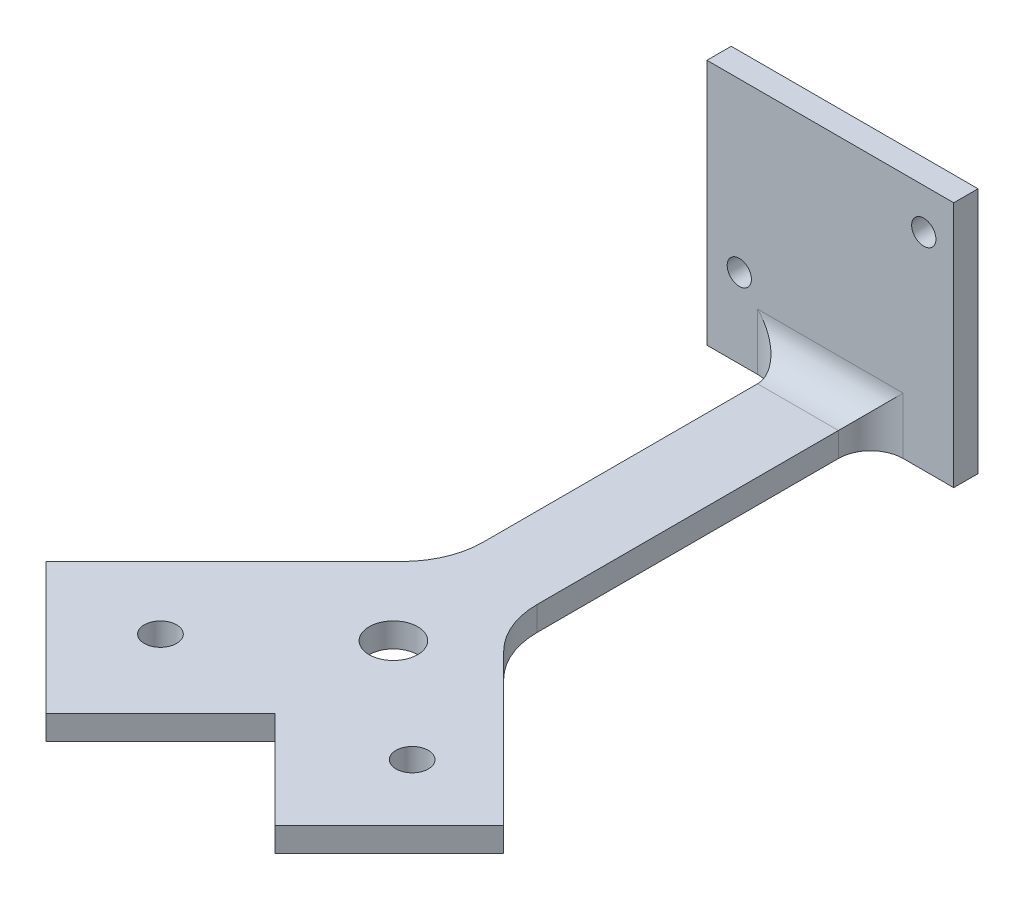
ISO-10303-21;
HEADER;
FILE_DESCRIPTION(('STEP AP214'),'2;1');
FILE_NAME('part.step','',(''),(''),'','','');
FILE_SCHEMA(('AUTOMOTIVE_DESIGN { 1 0 10303 214 1 1 1 1 }'));
ENDSEC;
DATA;
#1=APPLICATION_CONTEXT('core data for automotive mechanical design processes');
#2=APPLICATION_PROTOCOL_DEFINITION('international standard','automotive_design',2000,#1);
#3=PRODUCT_CONTEXT('',#1,'mechanical');
#4=PRODUCT('Part','Part','',(#3));
#5=PRODUCT_RELATED_PRODUCT_CATEGORY('part','',(#4));
#6=PRODUCT_DEFINITION_FORMATION('','',#4);
#7=PRODUCT_DEFINITION_CONTEXT('part definition',#1,'design');
#8=PRODUCT_DEFINITION('design','',#6,#7);
#9=PRODUCT_DEFINITION_SHAPE('','',#8);
#10=(LENGTH_UNIT() NAMED_UNIT(*) SI_UNIT(.MILLI.,.METRE.));
#11=(NAMED_UNIT(*) PLANE_ANGLE_UNIT() SI_UNIT($,.RADIAN.));
#12=(NAMED_UNIT(*) SI_UNIT($,.STERADIAN.) SOLID_ANGLE_UNIT());
#13=UNCERTAINTY_MEASURE_WITH_UNIT(LENGTH_MEASURE(1.E-05),#10,'distance_accuracy_value','');
#14=(GEOMETRIC_REPRESENTATION_CONTEXT(3) GLOBAL_UNCERTAINTY_ASSIGNED_CONTEXT((#13)) GLOBAL_UNIT_ASSIGNED_CONTEXT((#10,
#11,#12)) REPRESENTATION_CONTEXT('',''));
#15=CARTESIAN_POINT('',(0.,0.,0.));
#16=DIRECTION('',(0.,0.,1.));
#17=DIRECTION('',(1.,0.,0.));
#18=AXIS2_PLACEMENT_3D('',#15,#16,#17);
#19=CARTESIAN_POINT('',(0.,0.,3.));
#20=DIRECTION('',(0.,0.,-1.));
#21=DIRECTION('',(-1.,0.,0.));
#22=AXIS2_PLACEMENT_3D('',#19,#20,#21);
#23=PLANE('',#22);
#24=CARTESIAN_POINT('',(26.8,25.5,3.));
#25=DIRECTION('',(0.,0.,1.));
#26=DIRECTION('',(1.,0.,0.));
#27=AXIS2_PLACEMENT_3D('',#24,#25,#26);
#28=CIRCLE('',#27,1.49999999999999);
#29=CARTESIAN_POINT('',(28.3,25.5,3.));
#30=VERTEX_POINT('',#29);
#31=EDGE_CURVE('E562',#30,#30,#28,.T.);
#32=ORIENTED_EDGE('',*,*,#31,.F.);
#33=EDGE_LOOP('',(#32));
#34=FACE_BOUND('',#33,.T.);
#35=DIRECTION('',(1.,0.,0.));
#36=VECTOR('',#35,1.);
#37=CARTESIAN_POINT('',(0.,7.,3.));
#38=LINE('',#37,#36);
#39=CARTESIAN_POINT('',(6.25,7.,3.));
#40=VERTEX_POINT('',#39);
#41=CARTESIAN_POINT('',(24.25,7.,3.));
#42=VERTEX_POINT('',#41);
#43=EDGE_CURVE('E253',#40,#42,#38,.T.);
#44=ORIENTED_EDGE('',*,*,#43,.T.);
#45=DIRECTION('',(0.,-1.,0.));
#46=VECTOR('',#45,1.);
#47=CARTESIAN_POINT('',(24.25,0.,3.));
#48=LINE('',#47,#46);
#49=CARTESIAN_POINT('',(24.25,0.,3.));
#50=VERTEX_POINT('',#49);
#51=EDGE_CURVE('E257',#42,#50,#48,.T.);
#52=ORIENTED_EDGE('',*,*,#51,.T.);
#53=DIRECTION('',(1.,0.,0.));
#54=VECTOR('',#53,1.);
#55=CARTESIAN_POINT('',(0.,0.,3.));
#56=LINE('',#55,#54);
#57=CARTESIAN_POINT('',(30.5,0.,3.));
#58=VERTEX_POINT('',#57);
#59=EDGE_CURVE('E225',#50,#58,#56,.T.);
#60=ORIENTED_EDGE('',*,*,#59,.T.);
#61=DIRECTION('',(0.,1.,0.));
#62=VECTOR('',#61,1.);
#63=CARTESIAN_POINT('',(30.5,0.,3.));
#64=LINE('',#63,#62);
#65=CARTESIAN_POINT('',(30.5,30.5,3.));
#66=VERTEX_POINT('',#65);
#67=EDGE_CURVE('E230',#58,#66,#64,.T.);
#68=ORIENTED_EDGE('',*,*,#67,.T.);
#69=DIRECTION('',(-1.,0.,0.));
#70=VECTOR('',#69,1.);
#71=CARTESIAN_POINT('',(0.,30.5,3.));
#72=LINE('',#71,#70);
#73=CARTESIAN_POINT('',(0.,30.5,3.));
#74=VERTEX_POINT('',#73);
#75=EDGE_CURVE('E232',#66,#74,#72,.T.);
#76=ORIENTED_EDGE('',*,*,#75,.T.);
#77=DIRECTION('',(0.,-1.,0.));
#78=VECTOR('',#77,1.);
#79=CARTESIAN_POINT('',(0.,0.,3.));
#80=LINE('',#79,#78);
#81=CARTESIAN_POINT('',(0.,0.,3.));
#82=VERTEX_POINT('',#81);
#83=EDGE_CURVE('E222',#74,#82,#80,.T.);
#84=ORIENTED_EDGE('',*,*,#83,.T.);
#85=CARTESIAN_POINT('',(6.25,0.,3.));
#86=VERTEX_POINT('',#85);
#87=EDGE_CURVE('E227',#82,#86,#56,.T.);
#88=ORIENTED_EDGE('',*,*,#87,.T.);
#89=DIRECTION('',(0.,-1.,0.));
#90=VECTOR('',#89,1.);
#91=CARTESIAN_POINT('',(6.25,0.,3.));
#92=LINE('',#91,#90);
#93=EDGE_CURVE('E255',#86,#40,#92,.F.);
#94=ORIENTED_EDGE('',*,*,#93,.T.);
#95=EDGE_LOOP('',(#44,#52,#60,#68,#76,#84,#88,#94));
#96=FACE_BOUND('',#95,.T.);
#97=CARTESIAN_POINT('',(4.,9.80000000000002,3.));
#98=DIRECTION('',(0.,0.,1.));
#99=DIRECTION('',(1.,0.,0.));
#100=AXIS2_PLACEMENT_3D('',#97,#98,#99);
#101=CIRCLE('',#100,1.49999999999999);
#102=CARTESIAN_POINT('',(5.49999999999999,9.80000000000002,3.));
#103=VERTEX_POINT('',#102);
#104=EDGE_CURVE('E279',#103,#103,#101,.T.);
#105=ORIENTED_EDGE('',*,*,#104,.F.);
#106=EDGE_LOOP('',(#105));
#107=FACE_BOUND('',#106,.T.);
#108=ADVANCED_FACE('F33',(#34,#96,#107),#23,.F.);
#109=CARTESIAN_POINT('',(0.,0.,3.));
#110=DIRECTION('',(1.,0.,0.));
#111=DIRECTION('',(0.,0.,-1.));
#112=AXIS2_PLACEMENT_3D('',#109,#110,#111);
#113=PLANE('',#112);
#114=DIRECTION('',(0.,-1.,0.));
#115=VECTOR('',#114,1.);
#116=CARTESIAN_POINT('',(0.,0.,0.));
#117=LINE('',#116,#115);
#118=CARTESIAN_POINT('',(0.,30.5,0.));
#119=VERTEX_POINT('',#118);
#120=CARTESIAN_POINT('',(0.,0.,0.));
#121=VERTEX_POINT('',#120);
#122=EDGE_CURVE('E218',#119,#121,#117,.T.);
#123=ORIENTED_EDGE('',*,*,#122,.T.);
#124=DIRECTION('',(0.,0.,-1.));
#125=VECTOR('',#124,1.);
#126=CARTESIAN_POINT('',(0.,0.,3.));
#127=LINE('',#126,#125);
#128=EDGE_CURVE('E250',#82,#121,#127,.T.);
#129=ORIENTED_EDGE('',*,*,#128,.F.);
#130=ORIENTED_EDGE('',*,*,#83,.F.);
#131=DIRECTION('',(0.,0.,-1.));
#132=VECTOR('',#131,1.);
#133=CARTESIAN_POINT('',(0.,30.5,3.));
#134=LINE('',#133,#132);
#135=EDGE_CURVE('E234',#74,#119,#134,.T.);
#136=ORIENTED_EDGE('',*,*,#135,.T.);
#137=EDGE_LOOP('',(#123,#129,#130,#136));
#138=FACE_BOUND('',#137,.T.);
#139=ADVANCED_FACE('F342',(#138),#113,.F.);
#140=CARTESIAN_POINT('',(0.,0.,3.));
#141=DIRECTION('',(0.,1.,0.));
#142=DIRECTION('',(0.,0.,1.));
#143=AXIS2_PLACEMENT_3D('',#140,#141,#142);
#144=PLANE('',#143);
#145=CARTESIAN_POINT('',(29.1407993885725,0.,68.5740221249233));
#146=DIRECTION('',(0.,1.,0.));
#147=DIRECTION('',(0.,0.,1.));
#148=AXIS2_PLACEMENT_3D('',#145,#146,#147);
#149=CIRCLE('',#148,1.99999999999999);
#150=CARTESIAN_POINT('',(29.1407993885725,0.,70.5740221249233));
#151=VERTEX_POINT('',#150);
#152=EDGE_CURVE('E539',#151,#151,#149,.T.);
#153=ORIENTED_EDGE('',*,*,#152,.T.);
#154=EDGE_LOOP('',(#153));
#155=FACE_BOUND('',#154,.T.);
#156=CARTESIAN_POINT('',(0.149421359902709,0.,70.6953424684618));
#157=DIRECTION('',(0.,1.,0.));
#158=DIRECTION('',(0.,0.,1.));
#159=AXIS2_PLACEMENT_3D('',#156,#157,#158);
#160=CIRCLE('',#159,2.);
#161=CARTESIAN_POINT('',(0.149421359902709,0.,72.6953424684618));
#162=VERTEX_POINT('',#161);
#163=EDGE_CURVE('E549',#162,#162,#160,.T.);
#164=ORIENTED_EDGE('',*,*,#163,.T.);
#165=EDGE_LOOP('',(#164));
#166=FACE_BOUND('',#165,.T.);
#167=CARTESIAN_POINT('',(15.25,0.,57.));
#168=DIRECTION('',(0.,1.,0.));
#169=DIRECTION('',(0.,0.,1.));
#170=AXIS2_PLACEMENT_3D('',#167,#168,#169);
#171=CIRCLE('',#170,3.);
#172=CARTESIAN_POINT('',(15.25,0.,60.));
#173=VERTEX_POINT('',#172);
#174=EDGE_CURVE('E276',#173,#173,#171,.T.);
#175=ORIENTED_EDGE('',*,*,#174,.T.);
#176=EDGE_LOOP('',(#175));
#177=FACE_BOUND('',#176,.T.);
#178=ORIENTED_EDGE('',*,*,#59,.F.);
#179=CARTESIAN_POINT('',(24.25,0.,7.));
#180=DIRECTION('',(0.,1.,0.));
#181=DIRECTION('',(0.,0.,1.));
#182=AXIS2_PLACEMENT_3D('',#179,#180,#181);
#183=CIRCLE('',#182,4.);
#184=CARTESIAN_POINT('',(20.25,0.,7.));
#185=VERTEX_POINT('',#184);
#186=EDGE_CURVE('E268',#50,#185,#183,.T.);
#187=ORIENTED_EDGE('',*,*,#186,.T.);
#188=DIRECTION('',(0.,0.,1.));
#189=VECTOR('',#188,1.);
#190=CARTESIAN_POINT('',(20.25,0.,3.));
#191=LINE('',#190,#189);
#192=CARTESIAN_POINT('',(20.25,0.,44.227378613635));
#193=VERTEX_POINT('',#192);
#194=EDGE_CURVE('E215',#185,#193,#191,.T.);
#195=ORIENTED_EDGE('',*,*,#194,.T.);
#196=CARTESIAN_POINT('',(30.25,0.,44.227378613635));
#197=DIRECTION('',(0.,1.,0.));
#198=DIRECTION('',(0.,0.,1.));
#199=AXIS2_PLACEMENT_3D('',#196,#197,#198);
#200=CIRCLE('',#199,10.);
#201=CARTESIAN_POINT('',(23.1789321881345,0.,51.2984464255005));
#202=VERTEX_POINT('',#201);
#203=EDGE_CURVE('E289',#193,#202,#200,.T.);
#204=ORIENTED_EDGE('',*,*,#203,.T.);
#205=DIRECTION('',(0.707106781186543,0.,0.707106781186552));
#206=VECTOR('',#205,1.);
#207=CARTESIAN_POINT('',(22.5652428813171,0.,50.6847571186831));
#208=LINE('',#207,#206);
#209=CARTESIAN_POINT('',(41.8687214499304,0.,69.9882356872966));
#210=VERTEX_POINT('',#209);
#211=EDGE_CURVE('E162',#202,#210,#208,.T.);
#212=ORIENTED_EDGE('',*,*,#211,.T.);
#213=DIRECTION('',(-0.707106781186551,0.,0.707106781186544));
#214=VECTOR('',#213,1.);
#215=CARTESIAN_POINT('',(27.7265858261993,0.,84.1303713110274));
#216=LINE('',#215,#214);
#217=CARTESIAN_POINT('',(27.7265858261993,0.,84.1303713110274));
#218=VERTEX_POINT('',#217);
#219=EDGE_CURVE('E168',#210,#218,#216,.T.);
#220=ORIENTED_EDGE('',*,*,#219,.T.);
#221=DIRECTION('',(-0.707106781186544,0.,-0.707106781186551));
#222=VECTOR('',#221,1.);
#223=CARTESIAN_POINT('',(15.7057705460281,0.,72.109556030856));
#224=LINE('',#223,#222);
#225=CARTESIAN_POINT('',(15.7057705460281,0.,72.109556030856));
#226=VERTEX_POINT('',#225);
#227=EDGE_CURVE('E191',#218,#226,#224,.T.);
#228=ORIENTED_EDGE('',*,*,#227,.T.);
#229=DIRECTION('',(-0.707106781186551,0.,0.707106781186544));
#230=VECTOR('',#229,1.);
#231=CARTESIAN_POINT('',(1.56363492229706,0.,86.2516916545869));
#232=LINE('',#231,#230);
#233=CARTESIAN_POINT('',(1.56363492229706,0.,86.2516916545869));
#234=VERTEX_POINT('',#233);
#235=EDGE_CURVE('E195',#226,#234,#232,.T.);
#236=ORIENTED_EDGE('',*,*,#235,.T.);
#237=DIRECTION('',(-0.707106781186544,0.,-0.707106781186552));
#238=VECTOR('',#237,1.);
#239=CARTESIAN_POINT('',(-14.6998210449934,0.,69.9882356872962));
#240=LINE('',#239,#238);
#241=CARTESIAN_POINT('',(-14.6998210449934,0.,69.9882356872962));
#242=VERTEX_POINT('',#241);
#243=EDGE_CURVE('E198',#234,#242,#240,.T.);
#244=ORIENTED_EDGE('',*,*,#243,.T.);
#245=DIRECTION('',(0.707106781186551,0.,-0.707106781186544));
#246=VECTOR('',#245,1.);
#247=CARTESIAN_POINT('',(13.5844502024686,0.,41.7039644398345));
#248=LINE('',#247,#246);
#249=CARTESIAN_POINT('',(7.32106781186544,0.,47.9673468304376));
#250=VERTEX_POINT('',#249);
#251=EDGE_CURVE('E201',#242,#250,#248,.T.);
#252=ORIENTED_EDGE('',*,*,#251,.T.);
#253=CARTESIAN_POINT('',(0.25,0.,40.8962790185721));
#254=DIRECTION('',(0.,1.,0.));
#255=DIRECTION('',(0.,0.,1.));
#256=AXIS2_PLACEMENT_3D('',#253,#254,#255);
#257=CIRCLE('',#256,10.);
#258=CARTESIAN_POINT('',(10.25,0.,40.8962790185721));
#259=VERTEX_POINT('',#258);
#260=EDGE_CURVE('E41',#250,#259,#257,.T.);
#261=ORIENTED_EDGE('',*,*,#260,.T.);
#262=DIRECTION('',(0.,0.,-1.));
#263=VECTOR('',#262,1.);
#264=CARTESIAN_POINT('',(10.25,0.,3.));
#265=LINE('',#264,#263);
#266=CARTESIAN_POINT('',(10.25,0.,7.));
#267=VERTEX_POINT('',#266);
#268=EDGE_CURVE('E206',#259,#267,#265,.T.);
#269=ORIENTED_EDGE('',*,*,#268,.T.);
#270=CARTESIAN_POINT('',(6.25,0.,7.));
#271=DIRECTION('',(0.,1.,0.));
#272=DIRECTION('',(0.,0.,1.));
#273=AXIS2_PLACEMENT_3D('',#270,#271,#272);
#274=CIRCLE('',#273,4.);
#275=EDGE_CURVE('E270',#267,#86,#274,.T.);
#276=ORIENTED_EDGE('',*,*,#275,.T.);
#277=ORIENTED_EDGE('',*,*,#87,.F.);
#278=ORIENTED_EDGE('',*,*,#128,.T.);
#279=DIRECTION('',(1.,0.,0.));
#280=VECTOR('',#279,1.);
#281=CARTESIAN_POINT('',(0.,0.,0.));
#282=LINE('',#281,#280);
#283=CARTESIAN_POINT('',(30.5,0.,0.));
#284=VERTEX_POINT('',#283);
#285=EDGE_CURVE('E237',#121,#284,#282,.T.);
#286=ORIENTED_EDGE('',*,*,#285,.T.);
#287=DIRECTION('',(0.,0.,-1.));
#288=VECTOR('',#287,1.);
#289=CARTESIAN_POINT('',(30.5,0.,3.));
#290=LINE('',#289,#288);
#291=EDGE_CURVE('E247',#58,#284,#290,.T.);
#292=ORIENTED_EDGE('',*,*,#291,.F.);
#293=EDGE_LOOP('',(#178,#187,#195,#204,#212,#220,#228,#236,#244,#252,#261,#269,#276,#277,#278,
#286,#292));
#294=FACE_BOUND('',#293,.T.);
#295=ADVANCED_FACE('F292',(#155,#166,#177,#294),#144,.F.);
#296=CARTESIAN_POINT('',(30.5,0.,3.));
#297=DIRECTION('',(-1.,0.,0.));
#298=DIRECTION('',(0.,0.,1.));
#299=AXIS2_PLACEMENT_3D('',#296,#297,#298);
#300=PLANE('',#299);
#301=DIRECTION('',(0.,1.,0.));
#302=VECTOR('',#301,1.);
#303=CARTESIAN_POINT('',(30.5,0.,0.));
#304=LINE('',#303,#302);
#305=CARTESIAN_POINT('',(30.5,30.5,0.));
#306=VERTEX_POINT('',#305);
#307=EDGE_CURVE('E239',#284,#306,#304,.T.);
#308=ORIENTED_EDGE('',*,*,#307,.T.);
#309=DIRECTION('',(0.,0.,-1.));
#310=VECTOR('',#309,1.);
#311=CARTESIAN_POINT('',(30.5,30.5,3.));
#312=LINE('',#311,#310);
#313=EDGE_CURVE('E244',#66,#306,#312,.T.);
#314=ORIENTED_EDGE('',*,*,#313,.F.);
#315=ORIENTED_EDGE('',*,*,#67,.F.);
#316=ORIENTED_EDGE('',*,*,#291,.T.);
#317=EDGE_LOOP('',(#308,#314,#315,#316));
#318=FACE_BOUND('',#317,.T.);
#319=ADVANCED_FACE('F362',(#318),#300,.F.);
#320=CARTESIAN_POINT('',(0.,30.5,3.));
#321=DIRECTION('',(0.,-1.,0.));
#322=DIRECTION('',(0.,0.,-1.));
#323=AXIS2_PLACEMENT_3D('',#320,#321,#322);
#324=PLANE('',#323);
#325=DIRECTION('',(-1.,0.,0.));
#326=VECTOR('',#325,1.);
#327=CARTESIAN_POINT('',(0.,30.5,0.));
#328=LINE('',#327,#326);
#329=EDGE_CURVE('E226',#306,#119,#328,.T.);
#330=ORIENTED_EDGE('',*,*,#329,.T.);
#331=ORIENTED_EDGE('',*,*,#135,.F.);
#332=ORIENTED_EDGE('',*,*,#75,.F.);
#333=ORIENTED_EDGE('',*,*,#313,.T.);
#334=EDGE_LOOP('',(#330,#331,#332,#333));
#335=FACE_BOUND('',#334,.T.);
#336=ADVANCED_FACE('F358',(#335),#324,.F.);
#337=CARTESIAN_POINT('',(0.,0.,0.));
#338=DIRECTION('',(0.,0.,-1.));
#339=DIRECTION('',(-1.,0.,0.));
#340=AXIS2_PLACEMENT_3D('',#337,#338,#339);
#341=PLANE('',#340);
#342=CARTESIAN_POINT('',(4.,9.80000000000002,0.));
#343=DIRECTION('',(0.,0.,-1.));
#344=DIRECTION('',(-1.,0.,0.));
#345=AXIS2_PLACEMENT_3D('',#342,#343,#344);
#346=CIRCLE('',#345,1.49999999999999);
#347=CARTESIAN_POINT('',(2.50000000000001,9.80000000000002,0.));
#348=VERTEX_POINT('',#347);
#349=EDGE_CURVE('E559',#348,#348,#346,.T.);
#350=ORIENTED_EDGE('',*,*,#349,.F.);
#351=EDGE_LOOP('',(#350));
#352=FACE_BOUND('',#351,.T.);
#353=CARTESIAN_POINT('',(26.8,25.5,0.));
#354=DIRECTION('',(0.,0.,-1.));
#355=DIRECTION('',(-1.,0.,0.));
#356=AXIS2_PLACEMENT_3D('',#353,#354,#355);
#357=CIRCLE('',#356,1.49999999999999);
#358=CARTESIAN_POINT('',(25.3,25.5,0.));
#359=VERTEX_POINT('',#358);
#360=EDGE_CURVE('E192',#359,#359,#357,.T.);
#361=ORIENTED_EDGE('',*,*,#360,.F.);
#362=EDGE_LOOP('',(#361));
#363=FACE_BOUND('',#362,.T.);
#364=ORIENTED_EDGE('',*,*,#122,.F.);
#365=ORIENTED_EDGE('',*,*,#329,.F.);
#366=ORIENTED_EDGE('',*,*,#307,.F.);
#367=ORIENTED_EDGE('',*,*,#285,.F.);
#368=EDGE_LOOP('',(#364,#365,#366,#367));
#369=FACE_BOUND('',#368,.T.);
#370=ADVANCED_FACE('F355',(#352,#363,#369),#341,.T.);
#371=CARTESIAN_POINT('',(10.25,3.,3.));
#372=DIRECTION('',(-1.,0.,0.));
#373=DIRECTION('',(0.,0.,1.));
#374=AXIS2_PLACEMENT_3D('',#371,#372,#373);
#375=PLANE('',#374);
#376=ORIENTED_EDGE('',*,*,#268,.F.);
#377=DIRECTION('',(0.,-1.,0.));
#378=VECTOR('',#377,1.);
#379=CARTESIAN_POINT('',(10.25,3.,40.8962790185721));
#380=LINE('',#379,#378);
#381=CARTESIAN_POINT('',(10.25,3.,40.8962790185721));
#382=VERTEX_POINT('',#381);
#383=EDGE_CURVE('E54',#259,#382,#380,.F.);
#384=ORIENTED_EDGE('',*,*,#383,.T.);
#385=DIRECTION('',(0.,0.,-1.));
#386=VECTOR('',#385,1.);
#387=CARTESIAN_POINT('',(10.25,3.,3.));
#388=LINE('',#387,#386);
#389=CARTESIAN_POINT('',(10.25,3.,7.));
#390=VERTEX_POINT('',#389);
#391=EDGE_CURVE('E212',#382,#390,#388,.T.);
#392=ORIENTED_EDGE('',*,*,#391,.T.);
#393=DIRECTION('',(0.,-1.,0.));
#394=VECTOR('',#393,1.);
#395=CARTESIAN_POINT('',(10.25,3.,7.));
#396=LINE('',#395,#394);
#397=EDGE_CURVE('E262',#390,#267,#396,.T.);
#398=ORIENTED_EDGE('',*,*,#397,.T.);
#399=EDGE_LOOP('',(#376,#384,#392,#398));
#400=FACE_BOUND('',#399,.T.);
#401=ADVANCED_FACE('F315',(#400),#375,.T.);
#402=CARTESIAN_POINT('',(20.25,3.,3.));
#403=DIRECTION('',(1.,0.,0.));
#404=DIRECTION('',(0.,0.,-1.));
#405=AXIS2_PLACEMENT_3D('',#402,#403,#404);
#406=PLANE('',#405);
#407=DIRECTION('',(0.,0.,1.));
#408=VECTOR('',#407,1.);
#409=CARTESIAN_POINT('',(20.25,3.,3.));
#410=LINE('',#409,#408);
#411=CARTESIAN_POINT('',(20.25,3.,7.));
#412=VERTEX_POINT('',#411);
#413=CARTESIAN_POINT('',(20.25,3.,44.227378613635));
#414=VERTEX_POINT('',#413);
#415=EDGE_CURVE('E214',#412,#414,#410,.T.);
#416=ORIENTED_EDGE('',*,*,#415,.T.);
#417=DIRECTION('',(0.,1.,0.));
#418=VECTOR('',#417,1.);
#419=CARTESIAN_POINT('',(20.25,0.,44.227378613635));
#420=LINE('',#419,#418);
#421=EDGE_CURVE('E281',#414,#193,#420,.F.);
#422=ORIENTED_EDGE('',*,*,#421,.T.);
#423=ORIENTED_EDGE('',*,*,#194,.F.);
#424=DIRECTION('',(0.,-1.,0.));
#425=VECTOR('',#424,1.);
#426=CARTESIAN_POINT('',(20.25,3.,7.));
#427=LINE('',#426,#425);
#428=EDGE_CURVE('E260',#185,#412,#427,.F.);
#429=ORIENTED_EDGE('',*,*,#428,.T.);
#430=EDGE_LOOP('',(#416,#422,#423,#429));
#431=FACE_BOUND('',#430,.T.);
#432=ADVANCED_FACE('F299',(#431),#406,.T.);
#433=CARTESIAN_POINT('',(0.,3.,0.));
#434=DIRECTION('',(0.,1.,0.));
#435=DIRECTION('',(0.,0.,1.));
#436=AXIS2_PLACEMENT_3D('',#433,#434,#435);
#437=PLANE('',#436);
#438=CARTESIAN_POINT('',(29.1407993885725,3.,68.5740221249233));
#439=DIRECTION('',(0.,1.,0.));
#440=DIRECTION('',(0.,0.,1.));
#441=AXIS2_PLACEMENT_3D('',#438,#439,#440);
#442=CIRCLE('',#441,1.99999999999999);
#443=CARTESIAN_POINT('',(29.1407993885725,3.,70.5740221249233));
#444=VERTEX_POINT('',#443);
#445=EDGE_CURVE('E542',#444,#444,#442,.T.);
#446=ORIENTED_EDGE('',*,*,#445,.F.);
#447=EDGE_LOOP('',(#446));
#448=FACE_BOUND('',#447,.T.);
#449=CARTESIAN_POINT('',(0.149421359902709,3.,70.6953424684618));
#450=DIRECTION('',(0.,1.,0.));
#451=DIRECTION('',(0.,0.,1.));
#452=AXIS2_PLACEMENT_3D('',#449,#450,#451);
#453=CIRCLE('',#452,2.);
#454=CARTESIAN_POINT('',(0.149421359902709,3.,72.6953424684618));
#455=VERTEX_POINT('',#454);
#456=EDGE_CURVE('E544',#455,#455,#453,.T.);
#457=ORIENTED_EDGE('',*,*,#456,.F.);
#458=EDGE_LOOP('',(#457));
#459=FACE_BOUND('',#458,.T.);
#460=CARTESIAN_POINT('',(15.25,3.,57.));
#461=DIRECTION('',(0.,1.,0.));
#462=DIRECTION('',(0.,0.,1.));
#463=AXIS2_PLACEMENT_3D('',#460,#461,#462);
#464=CIRCLE('',#463,3.);
#465=CARTESIAN_POINT('',(15.25,3.,60.));
#466=VERTEX_POINT('',#465);
#467=EDGE_CURVE('E552',#466,#466,#464,.T.);
#468=ORIENTED_EDGE('',*,*,#467,.F.);
#469=EDGE_LOOP('',(#468));
#470=FACE_BOUND('',#469,.T.);
#471=ORIENTED_EDGE('',*,*,#415,.F.);
#472=DIRECTION('',(1.,0.,0.));
#473=VECTOR('',#472,1.);
#474=CARTESIAN_POINT('',(0.,3.,7.));
#475=LINE('',#474,#473);
#476=EDGE_CURVE('E265',#412,#390,#475,.F.);
#477=ORIENTED_EDGE('',*,*,#476,.T.);
#478=ORIENTED_EDGE('',*,*,#391,.F.);
#479=CARTESIAN_POINT('',(0.25,3.,40.8962790185721));
#480=DIRECTION('',(0.,1.,0.));
#481=DIRECTION('',(0.,0.,1.));
#482=AXIS2_PLACEMENT_3D('',#479,#480,#481);
#483=CIRCLE('',#482,10.);
#484=CARTESIAN_POINT('',(7.32106781186544,3.,47.9673468304376));
#485=VERTEX_POINT('',#484);
#486=EDGE_CURVE('E11',#382,#485,#483,.F.);
#487=ORIENTED_EDGE('',*,*,#486,.T.);
#488=DIRECTION('',(0.707106781186551,0.,-0.707106781186544));
#489=VECTOR('',#488,1.);
#490=CARTESIAN_POINT('',(13.5844502024686,3.,41.7039644398345));
#491=LINE('',#490,#489);
#492=CARTESIAN_POINT('',(-14.6998210449934,3.,69.9882356872962));
#493=VERTEX_POINT('',#492);
#494=EDGE_CURVE('E170',#493,#485,#491,.T.);
#495=ORIENTED_EDGE('',*,*,#494,.F.);
#496=DIRECTION('',(-0.707106781186544,0.,-0.707106781186552));
#497=VECTOR('',#496,1.);
#498=CARTESIAN_POINT('',(-14.6998210449934,3.,69.9882356872962));
#499=LINE('',#498,#497);
#500=CARTESIAN_POINT('',(1.56363492229706,3.,86.2516916545869));
#501=VERTEX_POINT('',#500);
#502=EDGE_CURVE('E185',#501,#493,#499,.T.);
#503=ORIENTED_EDGE('',*,*,#502,.F.);
#504=DIRECTION('',(-0.707106781186551,0.,0.707106781186544));
#505=VECTOR('',#504,1.);
#506=CARTESIAN_POINT('',(1.56363492229706,3.,86.2516916545869));
#507=LINE('',#506,#505);
#508=CARTESIAN_POINT('',(15.7057705460281,3.,72.109556030856));
#509=VERTEX_POINT('',#508);
#510=EDGE_CURVE('E179',#509,#501,#507,.T.);
#511=ORIENTED_EDGE('',*,*,#510,.F.);
#512=DIRECTION('',(-0.707106781186544,0.,-0.707106781186551));
#513=VECTOR('',#512,1.);
#514=CARTESIAN_POINT('',(15.7057705460281,3.,72.109556030856));
#515=LINE('',#514,#513);
#516=CARTESIAN_POINT('',(27.7265858261993,3.,84.1303713110274));
#517=VERTEX_POINT('',#516);
#518=EDGE_CURVE('E177',#517,#509,#515,.T.);
#519=ORIENTED_EDGE('',*,*,#518,.F.);
#520=DIRECTION('',(-0.707106781186551,0.,0.707106781186544));
#521=VECTOR('',#520,1.);
#522=CARTESIAN_POINT('',(27.7265858261993,3.,84.1303713110274));
#523=LINE('',#522,#521);
#524=CARTESIAN_POINT('',(41.8687214499304,3.,69.9882356872966));
#525=VERTEX_POINT('',#524);
#526=EDGE_CURVE('E161',#525,#517,#523,.T.);
#527=ORIENTED_EDGE('',*,*,#526,.F.);
#528=DIRECTION('',(0.707106781186544,0.,0.707106781186551));
#529=VECTOR('',#528,1.);
#530=CARTESIAN_POINT('',(41.8687214499304,3.,69.9882356872966));
#531=LINE('',#530,#529);
#532=CARTESIAN_POINT('',(23.1789321881345,3.,51.2984464255005));
#533=VERTEX_POINT('',#532);
#534=EDGE_CURVE('E151',#533,#525,#531,.T.);
#535=ORIENTED_EDGE('',*,*,#534,.F.);
#536=CARTESIAN_POINT('',(30.25,3.,44.227378613635));
#537=DIRECTION('',(0.,1.,0.));
#538=DIRECTION('',(0.,0.,1.));
#539=AXIS2_PLACEMENT_3D('',#536,#537,#538);
#540=CIRCLE('',#539,10.);
#541=EDGE_CURVE('E287',#533,#414,#540,.F.);
#542=ORIENTED_EDGE('',*,*,#541,.T.);
#543=EDGE_LOOP('',(#471,#477,#478,#487,#495,#503,#511,#519,#527,#535,#542));
#544=FACE_BOUND('',#543,.T.);
#545=ADVANCED_FACE('F174',(#448,#459,#470,#544),#437,.T.);
#546=CARTESIAN_POINT('',(22.5652428813171,3.,50.6847571186831));
#547=DIRECTION('',(0.707106781186552,0.,-0.707106781186543));
#548=DIRECTION('',(-0.707106781186543,0.,-0.707106781186552));
#549=AXIS2_PLACEMENT_3D('',#546,#547,#548);
#550=PLANE('',#549);
#551=ORIENTED_EDGE('',*,*,#211,.F.);
#552=DIRECTION('',(0.,1.,0.));
#553=VECTOR('',#552,1.);
#554=CARTESIAN_POINT('',(23.1789321881345,3.,51.2984464255005));
#555=LINE('',#554,#553);
#556=EDGE_CURVE('E158',#202,#533,#555,.T.);
#557=ORIENTED_EDGE('',*,*,#556,.T.);
#558=ORIENTED_EDGE('',*,*,#534,.T.);
#559=DIRECTION('',(0.,-1.,0.));
#560=VECTOR('',#559,1.);
#561=CARTESIAN_POINT('',(41.8687214499304,3.,69.9882356872966));
#562=LINE('',#561,#560);
#563=EDGE_CURVE('E155',#525,#210,#562,.T.);
#564=ORIENTED_EDGE('',*,*,#563,.T.);
#565=EDGE_LOOP('',(#551,#557,#558,#564));
#566=FACE_BOUND('',#565,.T.);
#567=ADVANCED_FACE('F154',(#566),#550,.T.);
#568=CARTESIAN_POINT('',(13.5844502024686,3.,41.7039644398345));
#569=DIRECTION('',(-0.707106781186544,0.,-0.707106781186551));
#570=DIRECTION('',(-0.707106781186551,0.,0.707106781186544));
#571=AXIS2_PLACEMENT_3D('',#568,#569,#570);
#572=PLANE('',#571);
#573=ORIENTED_EDGE('',*,*,#494,.T.);
#574=DIRECTION('',(0.,-1.,0.));
#575=VECTOR('',#574,1.);
#576=CARTESIAN_POINT('',(7.32106781186543,0.,47.9673468304376));
#577=LINE('',#576,#575);
#578=EDGE_CURVE('E283',#485,#250,#577,.T.);
#579=ORIENTED_EDGE('',*,*,#578,.T.);
#580=ORIENTED_EDGE('',*,*,#251,.F.);
#581=DIRECTION('',(0.,-1.,0.));
#582=VECTOR('',#581,1.);
#583=CARTESIAN_POINT('',(-14.6998210449934,3.,69.9882356872962));
#584=LINE('',#583,#582);
#585=EDGE_CURVE('E204',#493,#242,#584,.T.);
#586=ORIENTED_EDGE('',*,*,#585,.F.);
#587=EDGE_LOOP('',(#573,#579,#580,#586));
#588=FACE_BOUND('',#587,.T.);
#589=ADVANCED_FACE('F321',(#588),#572,.T.);
#590=CARTESIAN_POINT('',(-14.6998210449934,3.,69.9882356872962));
#591=DIRECTION('',(-0.707106781186551,0.,0.707106781186544));
#592=DIRECTION('',(0.707106781186544,0.,0.707106781186551));
#593=AXIS2_PLACEMENT_3D('',#590,#591,#592);
#594=PLANE('',#593);
#595=ORIENTED_EDGE('',*,*,#243,.F.);
#596=DIRECTION('',(0.,-1.,0.));
#597=VECTOR('',#596,1.);
#598=CARTESIAN_POINT('',(1.56363492229706,3.,86.2516916545869));
#599=LINE('',#598,#597);
#600=EDGE_CURVE('E207',#501,#234,#599,.T.);
#601=ORIENTED_EDGE('',*,*,#600,.F.);
#602=ORIENTED_EDGE('',*,*,#502,.T.);
#603=ORIENTED_EDGE('',*,*,#585,.T.);
#604=EDGE_LOOP('',(#595,#601,#602,#603));
#605=FACE_BOUND('',#604,.T.);
#606=ADVANCED_FACE('F325',(#605),#594,.T.);
#607=CARTESIAN_POINT('',(1.56363492229706,3.,86.2516916545869));
#608=DIRECTION('',(0.707106781186544,0.,0.707106781186551));
#609=DIRECTION('',(0.707106781186551,0.,-0.707106781186544));
#610=AXIS2_PLACEMENT_3D('',#607,#608,#609);
#611=PLANE('',#610);
#612=ORIENTED_EDGE('',*,*,#235,.F.);
#613=DIRECTION('',(0.,-1.,0.));
#614=VECTOR('',#613,1.);
#615=CARTESIAN_POINT('',(15.7057705460281,3.,72.109556030856));
#616=LINE('',#615,#614);
#617=EDGE_CURVE('E209',#509,#226,#616,.T.);
#618=ORIENTED_EDGE('',*,*,#617,.F.);
#619=ORIENTED_EDGE('',*,*,#510,.T.);
#620=ORIENTED_EDGE('',*,*,#600,.T.);
#621=EDGE_LOOP('',(#612,#618,#619,#620));
#622=FACE_BOUND('',#621,.T.);
#623=ADVANCED_FACE('F328',(#622),#611,.T.);
#624=CARTESIAN_POINT('',(15.7057705460281,3.,72.109556030856));
#625=DIRECTION('',(-0.707106781186551,0.,0.707106781186544));
#626=DIRECTION('',(0.707106781186544,0.,0.707106781186551));
#627=AXIS2_PLACEMENT_3D('',#624,#625,#626);
#628=PLANE('',#627);
#629=ORIENTED_EDGE('',*,*,#227,.F.);
#630=DIRECTION('',(0.,-1.,0.));
#631=VECTOR('',#630,1.);
#632=CARTESIAN_POINT('',(27.7265858261993,3.,84.1303713110274));
#633=LINE('',#632,#631);
#634=EDGE_CURVE('E169',#517,#218,#633,.T.);
#635=ORIENTED_EDGE('',*,*,#634,.F.);
#636=ORIENTED_EDGE('',*,*,#518,.T.);
#637=ORIENTED_EDGE('',*,*,#617,.T.);
#638=EDGE_LOOP('',(#629,#635,#636,#637));
#639=FACE_BOUND('',#638,.T.);
#640=ADVANCED_FACE('F331',(#639),#628,.T.);
#641=CARTESIAN_POINT('',(27.7265858261993,3.,84.1303713110274));
#642=DIRECTION('',(0.707106781186544,0.,0.707106781186551));
#643=DIRECTION('',(0.707106781186551,0.,-0.707106781186544));
#644=AXIS2_PLACEMENT_3D('',#641,#642,#643);
#645=PLANE('',#644);
#646=ORIENTED_EDGE('',*,*,#219,.F.);
#647=ORIENTED_EDGE('',*,*,#563,.F.);
#648=ORIENTED_EDGE('',*,*,#526,.T.);
#649=ORIENTED_EDGE('',*,*,#634,.T.);
#650=EDGE_LOOP('',(#646,#647,#648,#649));
#651=FACE_BOUND('',#650,.T.);
#652=ADVANCED_FACE('F166',(#651),#645,.T.);
#653=CARTESIAN_POINT('',(26.8,25.5,3.));
#654=DIRECTION('',(0.,0.,1.));
#655=DIRECTION('',(1.,0.,0.));
#656=AXIS2_PLACEMENT_3D('',#653,#654,#655);
#657=CYLINDRICAL_SURFACE('',#656,1.49999999999999);
#658=ORIENTED_EDGE('',*,*,#31,.T.);
#659=EDGE_LOOP('',(#658));
#660=FACE_BOUND('',#659,.T.);
#661=ORIENTED_EDGE('',*,*,#360,.T.);
#662=EDGE_LOOP('',(#661));
#663=FACE_BOUND('',#662,.T.);
#664=ADVANCED_FACE('F338',(#660,#663),#657,.F.);
#665=CARTESIAN_POINT('',(4.,9.80000000000002,3.));
#666=DIRECTION('',(0.,0.,1.));
#667=DIRECTION('',(1.,0.,0.));
#668=AXIS2_PLACEMENT_3D('',#665,#666,#667);
#669=CYLINDRICAL_SURFACE('',#668,1.49999999999999);
#670=ORIENTED_EDGE('',*,*,#104,.T.);
#671=EDGE_LOOP('',(#670));
#672=FACE_BOUND('',#671,.T.);
#673=ORIENTED_EDGE('',*,*,#349,.T.);
#674=EDGE_LOOP('',(#673));
#675=FACE_BOUND('',#674,.T.);
#676=ADVANCED_FACE('F375',(#672,#675),#669,.F.);
#677=CARTESIAN_POINT('',(6.25,3.,7.));
#678=DIRECTION('',(0.,-1.,0.));
#679=DIRECTION('',(0.,0.,-1.));
#680=AXIS2_PLACEMENT_3D('',#677,#678,#679);
#681=CYLINDRICAL_SURFACE('',#680,4.);
#682=ORIENTED_EDGE('',*,*,#275,.F.);
#683=ORIENTED_EDGE('',*,*,#397,.F.);
#684=CARTESIAN_POINT('',(6.25,7.,7.));
#685=DIRECTION('',(0.707106781186547,0.707106781186547,0.));
#686=DIRECTION('',(0.707106781186547,-0.707106781186547,0.));
#687=AXIS2_PLACEMENT_3D('',#684,#685,#686);
#688=ELLIPSE('',#687,5.65685424949238,4.);
#689=EDGE_CURVE('E275',#40,#390,#688,.F.);
#690=ORIENTED_EDGE('',*,*,#689,.F.);
#691=ORIENTED_EDGE('',*,*,#93,.F.);
#692=EDGE_LOOP('',(#682,#683,#690,#691));
#693=FACE_BOUND('',#692,.T.);
#694=ADVANCED_FACE('F313',(#693),#681,.F.);
#695=CARTESIAN_POINT('',(0.,7.,7.));
#696=DIRECTION('',(1.,0.,0.));
#697=DIRECTION('',(0.,0.,-1.));
#698=AXIS2_PLACEMENT_3D('',#695,#696,#697);
#699=CYLINDRICAL_SURFACE('',#698,4.);
#700=ORIENTED_EDGE('',*,*,#689,.T.);
#701=ORIENTED_EDGE('',*,*,#476,.F.);
#702=CARTESIAN_POINT('',(24.25,7.,7.));
#703=DIRECTION('',(0.707106781186547,-0.707106781186547,0.));
#704=DIRECTION('',(0.707106781186547,0.707106781186547,0.));
#705=AXIS2_PLACEMENT_3D('',#702,#703,#704);
#706=ELLIPSE('',#705,5.65685424949238,4.);
#707=EDGE_CURVE('E272',#42,#412,#706,.F.);
#708=ORIENTED_EDGE('',*,*,#707,.F.);
#709=ORIENTED_EDGE('',*,*,#43,.F.);
#710=EDGE_LOOP('',(#700,#701,#708,#709));
#711=FACE_BOUND('',#710,.T.);
#712=ADVANCED_FACE('F307',(#711),#699,.F.);
#713=CARTESIAN_POINT('',(24.25,0.,7.));
#714=DIRECTION('',(0.,-1.,0.));
#715=DIRECTION('',(0.,0.,-1.));
#716=AXIS2_PLACEMENT_3D('',#713,#714,#715);
#717=CYLINDRICAL_SURFACE('',#716,4.);
#718=ORIENTED_EDGE('',*,*,#707,.T.);
#719=ORIENTED_EDGE('',*,*,#428,.F.);
#720=ORIENTED_EDGE('',*,*,#186,.F.);
#721=ORIENTED_EDGE('',*,*,#51,.F.);
#722=EDGE_LOOP('',(#718,#719,#720,#721));
#723=FACE_BOUND('',#722,.T.);
#724=ADVANCED_FACE('F302',(#723),#717,.F.);
#725=CARTESIAN_POINT('',(30.25,3.,44.227378613635));
#726=DIRECTION('',(0.,-1.,0.));
#727=DIRECTION('',(0.,0.,-1.));
#728=AXIS2_PLACEMENT_3D('',#725,#726,#727);
#729=CYLINDRICAL_SURFACE('',#728,10.);
#730=ORIENTED_EDGE('',*,*,#203,.F.);
#731=ORIENTED_EDGE('',*,*,#421,.F.);
#732=ORIENTED_EDGE('',*,*,#541,.F.);
#733=ORIENTED_EDGE('',*,*,#556,.F.);
#734=EDGE_LOOP('',(#730,#731,#732,#733));
#735=FACE_BOUND('',#734,.T.);
#736=ADVANCED_FACE('F296',(#735),#729,.F.);
#737=CARTESIAN_POINT('',(0.25,3.,40.8962790185721));
#738=DIRECTION('',(0.,1.,0.));
#739=DIRECTION('',(0.,0.,1.));
#740=AXIS2_PLACEMENT_3D('',#737,#738,#739);
#741=CYLINDRICAL_SURFACE('',#740,10.);
#742=ORIENTED_EDGE('',*,*,#486,.F.);
#743=ORIENTED_EDGE('',*,*,#383,.F.);
#744=ORIENTED_EDGE('',*,*,#260,.F.);
#745=ORIENTED_EDGE('',*,*,#578,.F.);
#746=EDGE_LOOP('',(#742,#743,#744,#745));
#747=FACE_BOUND('',#746,.T.);
#748=ADVANCED_FACE('F35',(#747),#741,.F.);
#749=CARTESIAN_POINT('',(15.25,0.,57.));
#750=DIRECTION('',(0.,1.,0.));
#751=DIRECTION('',(0.,0.,1.));
#752=AXIS2_PLACEMENT_3D('',#749,#750,#751);
#753=CYLINDRICAL_SURFACE('',#752,3.);
#754=ORIENTED_EDGE('',*,*,#174,.F.);
#755=EDGE_LOOP('',(#754));
#756=FACE_BOUND('',#755,.T.);
#757=ORIENTED_EDGE('',*,*,#467,.T.);
#758=EDGE_LOOP('',(#757));
#759=FACE_BOUND('',#758,.T.);
#760=ADVANCED_FACE('F380',(#756,#759),#753,.F.);
#761=CARTESIAN_POINT('',(0.149421359902709,3.,70.6953424684618));
#762=DIRECTION('',(0.,1.,0.));
#763=DIRECTION('',(0.,0.,1.));
#764=AXIS2_PLACEMENT_3D('',#761,#762,#763);
#765=CYLINDRICAL_SURFACE('',#764,2.);
#766=ORIENTED_EDGE('',*,*,#163,.F.);
#767=EDGE_LOOP('',(#766));
#768=FACE_BOUND('',#767,.T.);
#769=ORIENTED_EDGE('',*,*,#456,.T.);
#770=EDGE_LOOP('',(#769));
#771=FACE_BOUND('',#770,.T.);
#772=ADVANCED_FACE('F384',(#768,#771),#765,.F.);
#773=CARTESIAN_POINT('',(29.1407993885725,3.,68.5740221249233));
#774=DIRECTION('',(0.,1.,0.));
#775=DIRECTION('',(0.,0.,1.));
#776=AXIS2_PLACEMENT_3D('',#773,#774,#775);
#777=CYLINDRICAL_SURFACE('',#776,1.99999999999999);
#778=ORIENTED_EDGE('',*,*,#152,.F.);
#779=EDGE_LOOP('',(#778));
#780=FACE_BOUND('',#779,.T.);
#781=ORIENTED_EDGE('',*,*,#445,.T.);
#782=EDGE_LOOP('',(#781));
#783=FACE_BOUND('',#782,.T.);
#784=ADVANCED_FACE('F390',(#780,#783),#777,.F.);
#785=CLOSED_SHELL('',(#108,#139,#295,#319,#336,#370,#401,#432,#545,#567,#589,#606,#623,#640,
#652,#664,#676,#694,#712,#724,#736,#748,#760,#772,#784));
#786=MANIFOLD_SOLID_BREP('B2',#785);
#787=ADVANCED_BREP_SHAPE_REPRESENTATION('',(#18,#786),#14);
#788=SHAPE_DEFINITION_REPRESENTATION(#9,#787);
ENDSEC;
END-ISO-10303-21;
